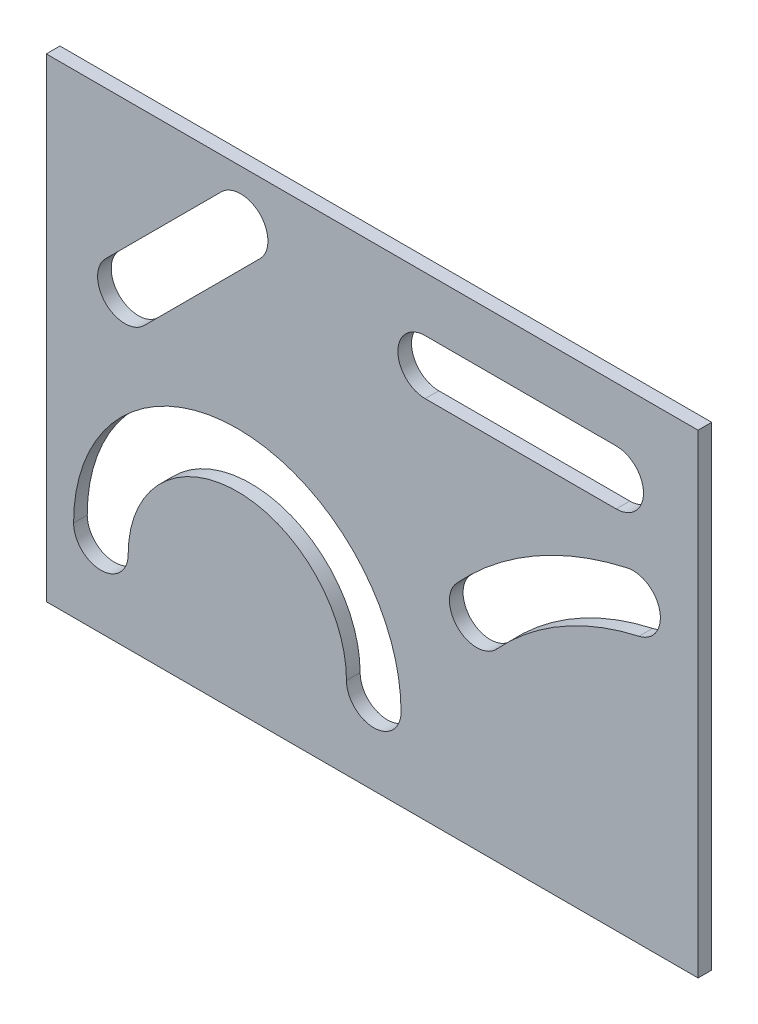
ISO-10303-21;
HEADER;
FILE_DESCRIPTION(('STEP AP214'),'2;1');
FILE_NAME('part.step','',(''),(''),'','','');
FILE_SCHEMA(('AUTOMOTIVE_DESIGN { 1 0 10303 214 1 1 1 1 }'));
ENDSEC;
DATA;
#1=APPLICATION_CONTEXT('core data for automotive mechanical design processes');
#2=APPLICATION_PROTOCOL_DEFINITION('international standard','automotive_design',2000,#1);
#3=PRODUCT_CONTEXT('',#1,'mechanical');
#4=PRODUCT('Part','Part','',(#3));
#5=PRODUCT_RELATED_PRODUCT_CATEGORY('part','',(#4));
#6=PRODUCT_DEFINITION_FORMATION('','',#4);
#7=PRODUCT_DEFINITION_CONTEXT('part definition',#1,'design');
#8=PRODUCT_DEFINITION('design','',#6,#7);
#9=PRODUCT_DEFINITION_SHAPE('','',#8);
#10=(LENGTH_UNIT() NAMED_UNIT(*) SI_UNIT(.MILLI.,.METRE.));
#11=(NAMED_UNIT(*) PLANE_ANGLE_UNIT() SI_UNIT($,.RADIAN.));
#12=(NAMED_UNIT(*) SI_UNIT($,.STERADIAN.) SOLID_ANGLE_UNIT());
#13=UNCERTAINTY_MEASURE_WITH_UNIT(LENGTH_MEASURE(1.E-05),#10,'distance_accuracy_value','');
#14=(GEOMETRIC_REPRESENTATION_CONTEXT(3) GLOBAL_UNCERTAINTY_ASSIGNED_CONTEXT((#13)) GLOBAL_UNIT_ASSIGNED_CONTEXT((#10,
#11,#12)) REPRESENTATION_CONTEXT('',''));
#15=CARTESIAN_POINT('',(0.,0.,0.));
#16=DIRECTION('',(0.,0.,1.));
#17=DIRECTION('',(1.,0.,0.));
#18=AXIS2_PLACEMENT_3D('',#15,#16,#17);
#19=CARTESIAN_POINT('',(238.835175967685,-173.857958976477,10.));
#20=DIRECTION('',(-1.,0.,0.));
#21=DIRECTION('',(0.,0.,1.));
#22=AXIS2_PLACEMENT_3D('',#19,#20,#21);
#23=PLANE('',#22);
#24=DIRECTION('',(0.,1.,0.));
#25=VECTOR('',#24,1.);
#26=CARTESIAN_POINT('',(238.835175967685,-173.857958976477,0.));
#27=LINE('',#26,#25);
#28=CARTESIAN_POINT('',(238.835175967685,-173.857958976477,0.));
#29=VERTEX_POINT('',#28);
#30=CARTESIAN_POINT('',(238.835175967685,173.857958976477,0.));
#31=VERTEX_POINT('',#30);
#32=EDGE_CURVE('E299',#29,#31,#27,.T.);
#33=ORIENTED_EDGE('',*,*,#32,.T.);
#34=DIRECTION('',(0.,0.,-1.));
#35=VECTOR('',#34,1.);
#36=CARTESIAN_POINT('',(238.835175967685,173.857958976477,10.));
#37=LINE('',#36,#35);
#38=CARTESIAN_POINT('',(238.835175967685,173.857958976477,10.));
#39=VERTEX_POINT('',#38);
#40=EDGE_CURVE('E11',#39,#31,#37,.T.);
#41=ORIENTED_EDGE('',*,*,#40,.F.);
#42=DIRECTION('',(0.,1.,0.));
#43=VECTOR('',#42,1.);
#44=CARTESIAN_POINT('',(238.835175967685,-173.857958976477,10.));
#45=LINE('',#44,#43);
#46=CARTESIAN_POINT('',(238.835175967685,-173.857958976477,10.));
#47=VERTEX_POINT('',#46);
#48=EDGE_CURVE('E306',#47,#39,#45,.T.);
#49=ORIENTED_EDGE('',*,*,#48,.F.);
#50=DIRECTION('',(0.,0.,-1.));
#51=VECTOR('',#50,1.);
#52=CARTESIAN_POINT('',(238.835175967685,-173.857958976477,10.));
#53=LINE('',#52,#51);
#54=EDGE_CURVE('E316',#47,#29,#53,.T.);
#55=ORIENTED_EDGE('',*,*,#54,.T.);
#56=EDGE_LOOP('',(#33,#41,#49,#55));
#57=FACE_BOUND('',#56,.T.);
#58=ADVANCED_FACE('F37',(#57),#23,.F.);
#59=CARTESIAN_POINT('',(-238.835175967685,173.857958976477,10.));
#60=DIRECTION('',(0.,-1.,0.));
#61=DIRECTION('',(0.,0.,-1.));
#62=AXIS2_PLACEMENT_3D('',#59,#60,#61);
#63=PLANE('',#62);
#64=DIRECTION('',(-1.,0.,0.));
#65=VECTOR('',#64,1.);
#66=CARTESIAN_POINT('',(-238.835175967685,173.857958976477,0.));
#67=LINE('',#66,#65);
#68=CARTESIAN_POINT('',(-238.835175967685,173.857958976477,0.));
#69=VERTEX_POINT('',#68);
#70=EDGE_CURVE('E319',#31,#69,#67,.T.);
#71=ORIENTED_EDGE('',*,*,#70,.T.);
#72=DIRECTION('',(0.,0.,-1.));
#73=VECTOR('',#72,1.);
#74=CARTESIAN_POINT('',(-238.835175967685,173.857958976477,10.));
#75=LINE('',#74,#73);
#76=CARTESIAN_POINT('',(-238.835175967685,173.857958976477,10.));
#77=VERTEX_POINT('',#76);
#78=EDGE_CURVE('E44',#77,#69,#75,.T.);
#79=ORIENTED_EDGE('',*,*,#78,.F.);
#80=DIRECTION('',(-1.,0.,0.));
#81=VECTOR('',#80,1.);
#82=CARTESIAN_POINT('',(-238.835175967685,173.857958976477,10.));
#83=LINE('',#82,#81);
#84=EDGE_CURVE('E309',#39,#77,#83,.T.);
#85=ORIENTED_EDGE('',*,*,#84,.F.);
#86=ORIENTED_EDGE('',*,*,#40,.T.);
#87=EDGE_LOOP('',(#71,#79,#85,#86));
#88=FACE_BOUND('',#87,.T.);
#89=ADVANCED_FACE('F348',(#88),#63,.F.);
#90=CARTESIAN_POINT('',(-238.835175967685,-173.857958976477,10.));
#91=DIRECTION('',(1.,0.,0.));
#92=DIRECTION('',(0.,0.,-1.));
#93=AXIS2_PLACEMENT_3D('',#90,#91,#92);
#94=PLANE('',#93);
#95=DIRECTION('',(0.,-1.,0.));
#96=VECTOR('',#95,1.);
#97=CARTESIAN_POINT('',(-238.835175967685,-173.857958976477,0.));
#98=LINE('',#97,#96);
#99=CARTESIAN_POINT('',(-238.835175967685,-173.857958976477,0.));
#100=VERTEX_POINT('',#99);
#101=EDGE_CURVE('E321',#69,#100,#98,.T.);
#102=ORIENTED_EDGE('',*,*,#101,.T.);
#103=DIRECTION('',(0.,0.,-1.));
#104=VECTOR('',#103,1.);
#105=CARTESIAN_POINT('',(-238.835175967685,-173.857958976477,10.));
#106=LINE('',#105,#104);
#107=CARTESIAN_POINT('',(-238.835175967685,-173.857958976477,10.));
#108=VERTEX_POINT('',#107);
#109=EDGE_CURVE('E326',#108,#100,#106,.T.);
#110=ORIENTED_EDGE('',*,*,#109,.F.);
#111=DIRECTION('',(0.,-1.,0.));
#112=VECTOR('',#111,1.);
#113=CARTESIAN_POINT('',(-238.835175967685,-173.857958976477,10.));
#114=LINE('',#113,#112);
#115=EDGE_CURVE('E312',#77,#108,#114,.T.);
#116=ORIENTED_EDGE('',*,*,#115,.F.);
#117=ORIENTED_EDGE('',*,*,#78,.T.);
#118=EDGE_LOOP('',(#102,#110,#116,#117));
#119=FACE_BOUND('',#118,.T.);
#120=ADVANCED_FACE('F333',(#119),#94,.F.);
#121=CARTESIAN_POINT('',(-238.835175967685,-173.857958976477,10.));
#122=DIRECTION('',(0.,1.,0.));
#123=DIRECTION('',(0.,0.,1.));
#124=AXIS2_PLACEMENT_3D('',#121,#122,#123);
#125=PLANE('',#124);
#126=DIRECTION('',(1.,0.,0.));
#127=VECTOR('',#126,1.);
#128=CARTESIAN_POINT('',(-238.835175967685,-173.857958976477,0.));
#129=LINE('',#128,#127);
#130=EDGE_CURVE('E310',#100,#29,#129,.T.);
#131=ORIENTED_EDGE('',*,*,#130,.T.);
#132=ORIENTED_EDGE('',*,*,#54,.F.);
#133=DIRECTION('',(1.,0.,0.));
#134=VECTOR('',#133,1.);
#135=CARTESIAN_POINT('',(-238.835175967685,-173.857958976477,10.));
#136=LINE('',#135,#134);
#137=EDGE_CURVE('E314',#108,#47,#136,.T.);
#138=ORIENTED_EDGE('',*,*,#137,.F.);
#139=ORIENTED_EDGE('',*,*,#109,.T.);
#140=EDGE_LOOP('',(#131,#132,#138,#139));
#141=FACE_BOUND('',#140,.T.);
#142=ADVANCED_FACE('F341',(#141),#125,.F.);
#143=CARTESIAN_POINT('',(0.,0.,10.));
#144=DIRECTION('',(0.,0.,-1.));
#145=DIRECTION('',(-1.,0.,0.));
#146=AXIS2_PLACEMENT_3D('',#143,#144,#145);
#147=PLANE('',#146);
#148=CARTESIAN_POINT('',(238.835175967685,-173.857958976477,10.));
#149=DIRECTION('',(0.,0.,1.));
#150=DIRECTION('',(1.,0.,0.));
#151=AXIS2_PLACEMENT_3D('',#148,#149,#150);
#152=CIRCLE('',#151,240.);
#153=CARTESIAN_POINT('',(186.88966862254,60.453082732307,10.));
#154=VERTEX_POINT('',#153);
#155=CARTESIAN_POINT('',(61.8886151332553,-11.7163091487189,10.));
#156=VERTEX_POINT('',#155);
#157=EDGE_CURVE('E200',#154,#156,#152,.T.);
#158=ORIENTED_EDGE('',*,*,#157,.F.);
#159=CARTESIAN_POINT('',(191.218460901303,40.9271625899084,10.));
#160=DIRECTION('',(0.,0.,1.));
#161=DIRECTION('',(1.,0.,0.));
#162=AXIS2_PLACEMENT_3D('',#159,#160,#161);
#163=CIRCLE('',#162,20.);
#164=CARTESIAN_POINT('',(195.547253180065,21.4012424475097,10.));
#165=VERTEX_POINT('',#164);
#166=EDGE_CURVE('E51',#165,#154,#163,.T.);
#167=ORIENTED_EDGE('',*,*,#166,.F.);
#168=CARTESIAN_POINT('',(238.835175967685,-173.857958976477,10.));
#169=DIRECTION('',(0.,0.,-1.));
#170=DIRECTION('',(1.,0.,0.));
#171=AXIS2_PLACEMENT_3D('',#168,#169,#170);
#172=CIRCLE('',#171,200.);
#173=CARTESIAN_POINT('',(91.3797086056603,-38.7399174533451,10.));
#174=VERTEX_POINT('',#173);
#175=EDGE_CURVE('E191',#174,#165,#172,.T.);
#176=ORIENTED_EDGE('',*,*,#175,.F.);
#177=CARTESIAN_POINT('',(76.6341618694577,-25.228113301032,10.));
#178=DIRECTION('',(0.,0.,1.));
#179=DIRECTION('',(1.,0.,0.));
#180=AXIS2_PLACEMENT_3D('',#177,#178,#179);
#181=CIRCLE('',#180,20.);
#182=EDGE_CURVE('E194',#156,#174,#181,.T.);
#183=ORIENTED_EDGE('',*,*,#182,.F.);
#184=EDGE_LOOP('',(#158,#167,#176,#183));
#185=FACE_BOUND('',#184,.T.);
#186=CARTESIAN_POINT('',(-98.8351759676853,-113.857958976477,10.));
#187=DIRECTION('',(0.,0.,1.));
#188=DIRECTION('',(1.,0.,0.));
#189=AXIS2_PLACEMENT_3D('',#186,#187,#188);
#190=CIRCLE('',#189,120.);
#191=CARTESIAN_POINT('',(21.1648240323147,-113.857958976477,10.));
#192=VERTEX_POINT('',#191);
#193=CARTESIAN_POINT('',(-218.835175967685,-113.857958976477,10.));
#194=VERTEX_POINT('',#193);
#195=EDGE_CURVE('E225',#192,#194,#190,.T.);
#196=ORIENTED_EDGE('',*,*,#195,.F.);
#197=CARTESIAN_POINT('',(1.1648240323147,-113.857958976477,10.));
#198=DIRECTION('',(0.,0.,1.));
#199=DIRECTION('',(1.,0.,0.));
#200=AXIS2_PLACEMENT_3D('',#197,#198,#199);
#201=CIRCLE('',#200,20.);
#202=CARTESIAN_POINT('',(-18.8351759676853,-113.857958976477,10.));
#203=VERTEX_POINT('',#202);
#204=EDGE_CURVE('E206',#203,#192,#201,.T.);
#205=ORIENTED_EDGE('',*,*,#204,.F.);
#206=CARTESIAN_POINT('',(-98.8351759676853,-113.857958976477,10.));
#207=DIRECTION('',(0.,0.,-1.));
#208=DIRECTION('',(1.,0.,0.));
#209=AXIS2_PLACEMENT_3D('',#206,#207,#208);
#210=CIRCLE('',#209,80.);
#211=CARTESIAN_POINT('',(-178.835175967685,-113.857958976477,10.));
#212=VERTEX_POINT('',#211);
#213=EDGE_CURVE('E214',#212,#203,#210,.T.);
#214=ORIENTED_EDGE('',*,*,#213,.F.);
#215=CARTESIAN_POINT('',(-198.835175967685,-113.857958976477,10.));
#216=DIRECTION('',(0.,0.,1.));
#217=DIRECTION('',(1.,0.,0.));
#218=AXIS2_PLACEMENT_3D('',#215,#216,#217);
#219=CIRCLE('',#218,20.);
#220=EDGE_CURVE('E228',#194,#212,#219,.T.);
#221=ORIENTED_EDGE('',*,*,#220,.F.);
#222=EDGE_LOOP('',(#196,#205,#214,#221));
#223=FACE_BOUND('',#222,.T.);
#224=DIRECTION('',(1.,0.,0.));
#225=VECTOR('',#224,1.);
#226=CARTESIAN_POINT('',(38.8351759676853,93.8579589764769,10.));
#227=LINE('',#226,#225);
#228=CARTESIAN_POINT('',(38.8351759676853,93.8579589764769,10.));
#229=VERTEX_POINT('',#228);
#230=CARTESIAN_POINT('',(178.835175967685,93.857958976477,10.));
#231=VERTEX_POINT('',#230);
#232=EDGE_CURVE('E257',#229,#231,#227,.T.);
#233=ORIENTED_EDGE('',*,*,#232,.F.);
#234=CARTESIAN_POINT('',(38.8351759676853,113.857958976477,10.));
#235=DIRECTION('',(0.,0.,1.));
#236=DIRECTION('',(1.,0.,0.));
#237=AXIS2_PLACEMENT_3D('',#234,#235,#236);
#238=CIRCLE('',#237,20.);
#239=CARTESIAN_POINT('',(38.8351759676853,133.857958976477,10.));
#240=VERTEX_POINT('',#239);
#241=EDGE_CURVE('E235',#240,#229,#238,.T.);
#242=ORIENTED_EDGE('',*,*,#241,.F.);
#243=DIRECTION('',(-1.,0.,0.));
#244=VECTOR('',#243,1.);
#245=CARTESIAN_POINT('',(38.8351759676853,133.857958976477,10.));
#246=LINE('',#245,#244);
#247=CARTESIAN_POINT('',(178.835175967685,133.857958976477,10.));
#248=VERTEX_POINT('',#247);
#249=EDGE_CURVE('E246',#248,#240,#246,.T.);
#250=ORIENTED_EDGE('',*,*,#249,.F.);
#251=CARTESIAN_POINT('',(178.835175967685,113.857958976477,10.));
#252=DIRECTION('',(0.,0.,1.));
#253=DIRECTION('',(1.,0.,0.));
#254=AXIS2_PLACEMENT_3D('',#251,#252,#253);
#255=CIRCLE('',#254,20.);
#256=EDGE_CURVE('E260',#231,#248,#255,.T.);
#257=ORIENTED_EDGE('',*,*,#256,.F.);
#258=EDGE_LOOP('',(#233,#242,#250,#257));
#259=FACE_BOUND('',#258,.T.);
#260=DIRECTION('',(0.707106781186552,0.707106781186543,0.));
#261=VECTOR('',#260,1.);
#262=CARTESIAN_POINT('',(-167.119447215148,37.2894164815533,10.));
#263=LINE('',#262,#261);
#264=CARTESIAN_POINT('',(-167.119447215148,37.2894164815533,10.));
#265=VERTEX_POINT('',#264);
#266=CARTESIAN_POINT('',(-82.2666334727614,122.142230223938,10.));
#267=VERTEX_POINT('',#266);
#268=EDGE_CURVE('E289',#265,#267,#263,.T.);
#269=ORIENTED_EDGE('',*,*,#268,.F.);
#270=CARTESIAN_POINT('',(-181.261582838878,51.4315521052843,10.));
#271=DIRECTION('',(0.,0.,1.));
#272=DIRECTION('',(1.,0.,0.));
#273=AXIS2_PLACEMENT_3D('',#270,#271,#272);
#274=CIRCLE('',#273,20.);
#275=CARTESIAN_POINT('',(-195.403718462609,65.5736877290153,10.));
#276=VERTEX_POINT('',#275);
#277=EDGE_CURVE('E267',#276,#265,#274,.T.);
#278=ORIENTED_EDGE('',*,*,#277,.F.);
#279=DIRECTION('',(-0.707106781186551,-0.707106781186544,0.));
#280=VECTOR('',#279,1.);
#281=CARTESIAN_POINT('',(-195.403718462609,65.5736877290153,10.));
#282=LINE('',#281,#280);
#283=CARTESIAN_POINT('',(-110.550904720223,150.426501471401,10.));
#284=VERTEX_POINT('',#283);
#285=EDGE_CURVE('E278',#284,#276,#282,.T.);
#286=ORIENTED_EDGE('',*,*,#285,.F.);
#287=CARTESIAN_POINT('',(-96.4087690964922,136.28436584767,10.));
#288=DIRECTION('',(0.,0.,1.));
#289=DIRECTION('',(1.,0.,0.));
#290=AXIS2_PLACEMENT_3D('',#287,#288,#289);
#291=CIRCLE('',#290,20.);
#292=EDGE_CURVE('E292',#267,#284,#291,.T.);
#293=ORIENTED_EDGE('',*,*,#292,.F.);
#294=EDGE_LOOP('',(#269,#278,#286,#293));
#295=FACE_BOUND('',#294,.T.);
#296=ORIENTED_EDGE('',*,*,#48,.T.);
#297=ORIENTED_EDGE('',*,*,#84,.T.);
#298=ORIENTED_EDGE('',*,*,#115,.T.);
#299=ORIENTED_EDGE('',*,*,#137,.T.);
#300=EDGE_LOOP('',(#296,#297,#298,#299));
#301=FACE_BOUND('',#300,.T.);
#302=ADVANCED_FACE('F347',(#185,#223,#259,#295,#301),#147,.F.);
#303=CARTESIAN_POINT('',(0.,0.,0.));
#304=DIRECTION('',(0.,0.,-1.));
#305=DIRECTION('',(-1.,0.,0.));
#306=AXIS2_PLACEMENT_3D('',#303,#304,#305);
#307=PLANE('',#306);
#308=CARTESIAN_POINT('',(191.218460901303,40.9271625899084,0.));
#309=DIRECTION('',(0.,0.,1.));
#310=DIRECTION('',(1.,0.,0.));
#311=AXIS2_PLACEMENT_3D('',#308,#309,#310);
#312=CIRCLE('',#311,20.);
#313=CARTESIAN_POINT('',(195.547253180065,21.4012424475097,0.));
#314=VERTEX_POINT('',#313);
#315=CARTESIAN_POINT('',(186.88966862254,60.453082732307,0.));
#316=VERTEX_POINT('',#315);
#317=EDGE_CURVE('E175',#314,#316,#312,.T.);
#318=ORIENTED_EDGE('',*,*,#317,.T.);
#319=CARTESIAN_POINT('',(238.835175967685,-173.857958976477,0.));
#320=DIRECTION('',(0.,0.,1.));
#321=DIRECTION('',(1.,0.,0.));
#322=AXIS2_PLACEMENT_3D('',#319,#320,#321);
#323=CIRCLE('',#322,240.);
#324=CARTESIAN_POINT('',(61.8886151332553,-11.7163091487189,0.));
#325=VERTEX_POINT('',#324);
#326=EDGE_CURVE('E184',#316,#325,#323,.T.);
#327=ORIENTED_EDGE('',*,*,#326,.T.);
#328=CARTESIAN_POINT('',(76.6341618694577,-25.228113301032,0.));
#329=DIRECTION('',(0.,0.,1.));
#330=DIRECTION('',(1.,0.,0.));
#331=AXIS2_PLACEMENT_3D('',#328,#329,#330);
#332=CIRCLE('',#331,20.);
#333=CARTESIAN_POINT('',(91.3797086056603,-38.7399174533451,0.));
#334=VERTEX_POINT('',#333);
#335=EDGE_CURVE('E59',#325,#334,#332,.T.);
#336=ORIENTED_EDGE('',*,*,#335,.T.);
#337=CARTESIAN_POINT('',(238.835175967685,-173.857958976477,0.));
#338=DIRECTION('',(0.,0.,-1.));
#339=DIRECTION('',(1.,0.,0.));
#340=AXIS2_PLACEMENT_3D('',#337,#338,#339);
#341=CIRCLE('',#340,200.);
#342=EDGE_CURVE('E181',#334,#314,#341,.T.);
#343=ORIENTED_EDGE('',*,*,#342,.T.);
#344=EDGE_LOOP('',(#318,#327,#336,#343));
#345=FACE_BOUND('',#344,.T.);
#346=CARTESIAN_POINT('',(1.1648240323147,-113.857958976477,0.));
#347=DIRECTION('',(0.,0.,1.));
#348=DIRECTION('',(1.,0.,0.));
#349=AXIS2_PLACEMENT_3D('',#346,#347,#348);
#350=CIRCLE('',#349,20.);
#351=CARTESIAN_POINT('',(-18.8351759676853,-113.857958976477,0.));
#352=VERTEX_POINT('',#351);
#353=CARTESIAN_POINT('',(21.1648240323147,-113.857958976477,0.));
#354=VERTEX_POINT('',#353);
#355=EDGE_CURVE('E210',#352,#354,#350,.T.);
#356=ORIENTED_EDGE('',*,*,#355,.T.);
#357=CARTESIAN_POINT('',(-98.8351759676853,-113.857958976477,0.));
#358=DIRECTION('',(0.,0.,1.));
#359=DIRECTION('',(1.,0.,0.));
#360=AXIS2_PLACEMENT_3D('',#357,#358,#359);
#361=CIRCLE('',#360,120.);
#362=CARTESIAN_POINT('',(-218.835175967685,-113.857958976477,0.));
#363=VERTEX_POINT('',#362);
#364=EDGE_CURVE('E213',#354,#363,#361,.T.);
#365=ORIENTED_EDGE('',*,*,#364,.T.);
#366=CARTESIAN_POINT('',(-198.835175967685,-113.857958976477,0.));
#367=DIRECTION('',(0.,0.,1.));
#368=DIRECTION('',(1.,0.,0.));
#369=AXIS2_PLACEMENT_3D('',#366,#367,#368);
#370=CIRCLE('',#369,20.);
#371=CARTESIAN_POINT('',(-178.835175967685,-113.857958976477,0.));
#372=VERTEX_POINT('',#371);
#373=EDGE_CURVE('E217',#363,#372,#370,.T.);
#374=ORIENTED_EDGE('',*,*,#373,.T.);
#375=CARTESIAN_POINT('',(-98.8351759676853,-113.857958976477,0.));
#376=DIRECTION('',(0.,0.,-1.));
#377=DIRECTION('',(1.,0.,0.));
#378=AXIS2_PLACEMENT_3D('',#375,#376,#377);
#379=CIRCLE('',#378,80.);
#380=EDGE_CURVE('E220',#372,#352,#379,.T.);
#381=ORIENTED_EDGE('',*,*,#380,.T.);
#382=EDGE_LOOP('',(#356,#365,#374,#381));
#383=FACE_BOUND('',#382,.T.);
#384=CARTESIAN_POINT('',(38.8351759676853,113.857958976477,0.));
#385=DIRECTION('',(0.,0.,1.));
#386=DIRECTION('',(1.,0.,0.));
#387=AXIS2_PLACEMENT_3D('',#384,#385,#386);
#388=CIRCLE('',#387,20.);
#389=CARTESIAN_POINT('',(38.8351759676853,133.857958976477,0.));
#390=VERTEX_POINT('',#389);
#391=CARTESIAN_POINT('',(38.8351759676853,93.8579589764769,0.));
#392=VERTEX_POINT('',#391);
#393=EDGE_CURVE('E242',#390,#392,#388,.T.);
#394=ORIENTED_EDGE('',*,*,#393,.T.);
#395=DIRECTION('',(1.,0.,0.));
#396=VECTOR('',#395,1.);
#397=CARTESIAN_POINT('',(38.8351759676853,93.8579589764769,0.));
#398=LINE('',#397,#396);
#399=CARTESIAN_POINT('',(178.835175967685,93.857958976477,0.));
#400=VERTEX_POINT('',#399);
#401=EDGE_CURVE('E245',#392,#400,#398,.T.);
#402=ORIENTED_EDGE('',*,*,#401,.T.);
#403=CARTESIAN_POINT('',(178.835175967685,113.857958976477,0.));
#404=DIRECTION('',(0.,0.,1.));
#405=DIRECTION('',(1.,0.,0.));
#406=AXIS2_PLACEMENT_3D('',#403,#404,#405);
#407=CIRCLE('',#406,20.);
#408=CARTESIAN_POINT('',(178.835175967685,133.857958976477,0.));
#409=VERTEX_POINT('',#408);
#410=EDGE_CURVE('E249',#400,#409,#407,.T.);
#411=ORIENTED_EDGE('',*,*,#410,.T.);
#412=DIRECTION('',(-1.,0.,0.));
#413=VECTOR('',#412,1.);
#414=CARTESIAN_POINT('',(38.8351759676853,133.857958976477,0.));
#415=LINE('',#414,#413);
#416=EDGE_CURVE('E252',#409,#390,#415,.T.);
#417=ORIENTED_EDGE('',*,*,#416,.T.);
#418=EDGE_LOOP('',(#394,#402,#411,#417));
#419=FACE_BOUND('',#418,.T.);
#420=CARTESIAN_POINT('',(-181.261582838878,51.4315521052843,0.));
#421=DIRECTION('',(0.,0.,1.));
#422=DIRECTION('',(1.,0.,0.));
#423=AXIS2_PLACEMENT_3D('',#420,#421,#422);
#424=CIRCLE('',#423,20.);
#425=CARTESIAN_POINT('',(-195.403718462609,65.5736877290153,0.));
#426=VERTEX_POINT('',#425);
#427=CARTESIAN_POINT('',(-167.119447215148,37.2894164815533,0.));
#428=VERTEX_POINT('',#427);
#429=EDGE_CURVE('E274',#426,#428,#424,.T.);
#430=ORIENTED_EDGE('',*,*,#429,.T.);
#431=DIRECTION('',(0.707106781186552,0.707106781186543,0.));
#432=VECTOR('',#431,1.);
#433=CARTESIAN_POINT('',(-167.119447215148,37.2894164815533,0.));
#434=LINE('',#433,#432);
#435=CARTESIAN_POINT('',(-82.2666334727614,122.142230223938,0.));
#436=VERTEX_POINT('',#435);
#437=EDGE_CURVE('E277',#428,#436,#434,.T.);
#438=ORIENTED_EDGE('',*,*,#437,.T.);
#439=CARTESIAN_POINT('',(-96.4087690964922,136.28436584767,0.));
#440=DIRECTION('',(0.,0.,1.));
#441=DIRECTION('',(1.,0.,0.));
#442=AXIS2_PLACEMENT_3D('',#439,#440,#441);
#443=CIRCLE('',#442,20.);
#444=CARTESIAN_POINT('',(-110.550904720223,150.426501471401,0.));
#445=VERTEX_POINT('',#444);
#446=EDGE_CURVE('E281',#436,#445,#443,.T.);
#447=ORIENTED_EDGE('',*,*,#446,.T.);
#448=DIRECTION('',(-0.707106781186551,-0.707106781186544,0.));
#449=VECTOR('',#448,1.);
#450=CARTESIAN_POINT('',(-195.403718462609,65.5736877290153,0.));
#451=LINE('',#450,#449);
#452=EDGE_CURVE('E284',#445,#426,#451,.T.);
#453=ORIENTED_EDGE('',*,*,#452,.T.);
#454=EDGE_LOOP('',(#430,#438,#447,#453));
#455=FACE_BOUND('',#454,.T.);
#456=ORIENTED_EDGE('',*,*,#32,.F.);
#457=ORIENTED_EDGE('',*,*,#130,.F.);
#458=ORIENTED_EDGE('',*,*,#101,.F.);
#459=ORIENTED_EDGE('',*,*,#70,.F.);
#460=EDGE_LOOP('',(#456,#457,#458,#459));
#461=FACE_BOUND('',#460,.T.);
#462=ADVANCED_FACE('F188',(#345,#383,#419,#455,#461),#307,.T.);
#463=CARTESIAN_POINT('',(-181.261582838878,51.4315521052843,0.));
#464=DIRECTION('',(0.,0.,1.));
#465=DIRECTION('',(1.,0.,0.));
#466=AXIS2_PLACEMENT_3D('',#463,#464,#465);
#467=CYLINDRICAL_SURFACE('',#466,20.);
#468=ORIENTED_EDGE('',*,*,#277,.T.);
#469=DIRECTION('',(0.,0.,1.));
#470=VECTOR('',#469,1.);
#471=CARTESIAN_POINT('',(-167.119447215148,37.2894164815533,0.));
#472=LINE('',#471,#470);
#473=EDGE_CURVE('E287',#428,#265,#472,.T.);
#474=ORIENTED_EDGE('',*,*,#473,.F.);
#475=ORIENTED_EDGE('',*,*,#429,.F.);
#476=DIRECTION('',(0.,0.,1.));
#477=VECTOR('',#476,1.);
#478=CARTESIAN_POINT('',(-195.403718462609,65.5736877290153,0.));
#479=LINE('',#478,#477);
#480=EDGE_CURVE('E297',#426,#276,#479,.T.);
#481=ORIENTED_EDGE('',*,*,#480,.T.);
#482=EDGE_LOOP('',(#468,#474,#475,#481));
#483=FACE_BOUND('',#482,.T.);
#484=ADVANCED_FACE('F360',(#483),#467,.F.);
#485=CARTESIAN_POINT('',(-195.403718462609,65.5736877290153,0.));
#486=DIRECTION('',(-0.707106781186544,0.707106781186551,0.));
#487=DIRECTION('',(-0.707106781186551,-0.707106781186544,0.));
#488=AXIS2_PLACEMENT_3D('',#485,#486,#487);
#489=PLANE('',#488);
#490=ORIENTED_EDGE('',*,*,#285,.T.);
#491=ORIENTED_EDGE('',*,*,#480,.F.);
#492=ORIENTED_EDGE('',*,*,#452,.F.);
#493=DIRECTION('',(0.,0.,1.));
#494=VECTOR('',#493,1.);
#495=CARTESIAN_POINT('',(-110.550904720223,150.426501471401,0.));
#496=LINE('',#495,#494);
#497=EDGE_CURVE('E300',#445,#284,#496,.T.);
#498=ORIENTED_EDGE('',*,*,#497,.T.);
#499=EDGE_LOOP('',(#490,#491,#492,#498));
#500=FACE_BOUND('',#499,.T.);
#501=ADVANCED_FACE('F366',(#500),#489,.F.);
#502=CARTESIAN_POINT('',(-96.4087690964922,136.28436584767,0.));
#503=DIRECTION('',(0.,0.,1.));
#504=DIRECTION('',(1.,0.,0.));
#505=AXIS2_PLACEMENT_3D('',#502,#503,#504);
#506=CYLINDRICAL_SURFACE('',#505,20.);
#507=ORIENTED_EDGE('',*,*,#292,.T.);
#508=ORIENTED_EDGE('',*,*,#497,.F.);
#509=ORIENTED_EDGE('',*,*,#446,.F.);
#510=DIRECTION('',(0.,0.,1.));
#511=VECTOR('',#510,1.);
#512=CARTESIAN_POINT('',(-82.2666334727614,122.142230223938,0.));
#513=LINE('',#512,#511);
#514=EDGE_CURVE('E302',#436,#267,#513,.T.);
#515=ORIENTED_EDGE('',*,*,#514,.T.);
#516=EDGE_LOOP('',(#507,#508,#509,#515));
#517=FACE_BOUND('',#516,.T.);
#518=ADVANCED_FACE('F372',(#517),#506,.F.);
#519=CARTESIAN_POINT('',(-167.119447215148,37.2894164815533,0.));
#520=DIRECTION('',(0.707106781186543,-0.707106781186552,0.));
#521=DIRECTION('',(0.707106781186552,0.707106781186543,0.));
#522=AXIS2_PLACEMENT_3D('',#519,#520,#521);
#523=PLANE('',#522);
#524=ORIENTED_EDGE('',*,*,#268,.T.);
#525=ORIENTED_EDGE('',*,*,#514,.F.);
#526=ORIENTED_EDGE('',*,*,#437,.F.);
#527=ORIENTED_EDGE('',*,*,#473,.T.);
#528=EDGE_LOOP('',(#524,#525,#526,#527));
#529=FACE_BOUND('',#528,.T.);
#530=ADVANCED_FACE('F368',(#529),#523,.F.);
#531=CARTESIAN_POINT('',(38.8351759676853,113.857958976477,0.));
#532=DIRECTION('',(0.,0.,1.));
#533=DIRECTION('',(1.,0.,0.));
#534=AXIS2_PLACEMENT_3D('',#531,#532,#533);
#535=CYLINDRICAL_SURFACE('',#534,20.);
#536=ORIENTED_EDGE('',*,*,#241,.T.);
#537=DIRECTION('',(0.,0.,1.));
#538=VECTOR('',#537,1.);
#539=CARTESIAN_POINT('',(38.8351759676853,93.8579589764769,0.));
#540=LINE('',#539,#538);
#541=EDGE_CURVE('E255',#392,#229,#540,.T.);
#542=ORIENTED_EDGE('',*,*,#541,.F.);
#543=ORIENTED_EDGE('',*,*,#393,.F.);
#544=DIRECTION('',(0.,0.,1.));
#545=VECTOR('',#544,1.);
#546=CARTESIAN_POINT('',(38.8351759676853,133.857958976477,0.));
#547=LINE('',#546,#545);
#548=EDGE_CURVE('E265',#390,#240,#547,.T.);
#549=ORIENTED_EDGE('',*,*,#548,.T.);
#550=EDGE_LOOP('',(#536,#542,#543,#549));
#551=FACE_BOUND('',#550,.T.);
#552=ADVANCED_FACE('F371',(#551),#535,.F.);
#553=CARTESIAN_POINT('',(38.8351759676853,133.857958976477,0.));
#554=DIRECTION('',(0.,1.,0.));
#555=DIRECTION('',(-1.,0.,0.));
#556=AXIS2_PLACEMENT_3D('',#553,#554,#555);
#557=PLANE('',#556);
#558=ORIENTED_EDGE('',*,*,#249,.T.);
#559=ORIENTED_EDGE('',*,*,#548,.F.);
#560=ORIENTED_EDGE('',*,*,#416,.F.);
#561=DIRECTION('',(0.,0.,1.));
#562=VECTOR('',#561,1.);
#563=CARTESIAN_POINT('',(178.835175967685,133.857958976477,0.));
#564=LINE('',#563,#562);
#565=EDGE_CURVE('E268',#409,#248,#564,.T.);
#566=ORIENTED_EDGE('',*,*,#565,.T.);
#567=EDGE_LOOP('',(#558,#559,#560,#566));
#568=FACE_BOUND('',#567,.T.);
#569=ADVANCED_FACE('F382',(#568),#557,.F.);
#570=CARTESIAN_POINT('',(178.835175967685,113.857958976477,0.));
#571=DIRECTION('',(0.,0.,1.));
#572=DIRECTION('',(1.,0.,0.));
#573=AXIS2_PLACEMENT_3D('',#570,#571,#572);
#574=CYLINDRICAL_SURFACE('',#573,20.);
#575=ORIENTED_EDGE('',*,*,#256,.T.);
#576=ORIENTED_EDGE('',*,*,#565,.F.);
#577=ORIENTED_EDGE('',*,*,#410,.F.);
#578=DIRECTION('',(0.,0.,1.));
#579=VECTOR('',#578,1.);
#580=CARTESIAN_POINT('',(178.835175967685,93.857958976477,0.));
#581=LINE('',#580,#579);
#582=EDGE_CURVE('E270',#400,#231,#581,.T.);
#583=ORIENTED_EDGE('',*,*,#582,.T.);
#584=EDGE_LOOP('',(#575,#576,#577,#583));
#585=FACE_BOUND('',#584,.T.);
#586=ADVANCED_FACE('F388',(#585),#574,.F.);
#587=CARTESIAN_POINT('',(38.8351759676853,93.8579589764769,0.));
#588=DIRECTION('',(0.,-1.,0.));
#589=DIRECTION('',(1.,0.,0.));
#590=AXIS2_PLACEMENT_3D('',#587,#588,#589);
#591=PLANE('',#590);
#592=ORIENTED_EDGE('',*,*,#232,.T.);
#593=ORIENTED_EDGE('',*,*,#582,.F.);
#594=ORIENTED_EDGE('',*,*,#401,.F.);
#595=ORIENTED_EDGE('',*,*,#541,.T.);
#596=EDGE_LOOP('',(#592,#593,#594,#595));
#597=FACE_BOUND('',#596,.T.);
#598=ADVANCED_FACE('F384',(#597),#591,.F.);
#599=CARTESIAN_POINT('',(1.1648240323147,-113.857958976477,0.));
#600=DIRECTION('',(0.,0.,1.));
#601=DIRECTION('',(1.,0.,0.));
#602=AXIS2_PLACEMENT_3D('',#599,#600,#601);
#603=CYLINDRICAL_SURFACE('',#602,20.);
#604=ORIENTED_EDGE('',*,*,#204,.T.);
#605=DIRECTION('',(0.,0.,1.));
#606=VECTOR('',#605,1.);
#607=CARTESIAN_POINT('',(21.1648240323147,-113.857958976477,0.));
#608=LINE('',#607,#606);
#609=EDGE_CURVE('E223',#354,#192,#608,.T.);
#610=ORIENTED_EDGE('',*,*,#609,.F.);
#611=ORIENTED_EDGE('',*,*,#355,.F.);
#612=DIRECTION('',(0.,0.,1.));
#613=VECTOR('',#612,1.);
#614=CARTESIAN_POINT('',(-18.8351759676853,-113.857958976477,0.));
#615=LINE('',#614,#613);
#616=EDGE_CURVE('E233',#352,#203,#615,.T.);
#617=ORIENTED_EDGE('',*,*,#616,.T.);
#618=EDGE_LOOP('',(#604,#610,#611,#617));
#619=FACE_BOUND('',#618,.T.);
#620=ADVANCED_FACE('F387',(#619),#603,.F.);
#621=CARTESIAN_POINT('',(-98.8351759676853,-113.857958976477,0.));
#622=DIRECTION('',(0.,0.,1.));
#623=DIRECTION('',(1.,0.,0.));
#624=AXIS2_PLACEMENT_3D('',#621,#622,#623);
#625=CYLINDRICAL_SURFACE('',#624,80.);
#626=ORIENTED_EDGE('',*,*,#213,.T.);
#627=ORIENTED_EDGE('',*,*,#616,.F.);
#628=ORIENTED_EDGE('',*,*,#380,.F.);
#629=DIRECTION('',(0.,0.,1.));
#630=VECTOR('',#629,1.);
#631=CARTESIAN_POINT('',(-178.835175967685,-113.857958976477,0.));
#632=LINE('',#631,#630);
#633=EDGE_CURVE('E236',#372,#212,#632,.T.);
#634=ORIENTED_EDGE('',*,*,#633,.T.);
#635=EDGE_LOOP('',(#626,#627,#628,#634));
#636=FACE_BOUND('',#635,.T.);
#637=ADVANCED_FACE('F398',(#636),#625,.T.);
#638=CARTESIAN_POINT('',(-198.835175967685,-113.857958976477,0.));
#639=DIRECTION('',(0.,0.,1.));
#640=DIRECTION('',(1.,0.,0.));
#641=AXIS2_PLACEMENT_3D('',#638,#639,#640);
#642=CYLINDRICAL_SURFACE('',#641,20.);
#643=ORIENTED_EDGE('',*,*,#220,.T.);
#644=ORIENTED_EDGE('',*,*,#633,.F.);
#645=ORIENTED_EDGE('',*,*,#373,.F.);
#646=DIRECTION('',(0.,0.,1.));
#647=VECTOR('',#646,1.);
#648=CARTESIAN_POINT('',(-218.835175967685,-113.857958976477,0.));
#649=LINE('',#648,#647);
#650=EDGE_CURVE('E238',#363,#194,#649,.T.);
#651=ORIENTED_EDGE('',*,*,#650,.T.);
#652=EDGE_LOOP('',(#643,#644,#645,#651));
#653=FACE_BOUND('',#652,.T.);
#654=ADVANCED_FACE('F403',(#653),#642,.F.);
#655=CARTESIAN_POINT('',(-98.8351759676853,-113.857958976477,0.));
#656=DIRECTION('',(0.,0.,1.));
#657=DIRECTION('',(1.,0.,0.));
#658=AXIS2_PLACEMENT_3D('',#655,#656,#657);
#659=CYLINDRICAL_SURFACE('',#658,120.);
#660=ORIENTED_EDGE('',*,*,#195,.T.);
#661=ORIENTED_EDGE('',*,*,#650,.F.);
#662=ORIENTED_EDGE('',*,*,#364,.F.);
#663=ORIENTED_EDGE('',*,*,#609,.T.);
#664=EDGE_LOOP('',(#660,#661,#662,#663));
#665=FACE_BOUND('',#664,.T.);
#666=ADVANCED_FACE('F400',(#665),#659,.F.);
#667=CARTESIAN_POINT('',(191.218460901303,40.9271625899084,0.));
#668=DIRECTION('',(0.,0.,1.));
#669=DIRECTION('',(1.,0.,0.));
#670=AXIS2_PLACEMENT_3D('',#667,#668,#669);
#671=CYLINDRICAL_SURFACE('',#670,20.);
#672=ORIENTED_EDGE('',*,*,#166,.T.);
#673=DIRECTION('',(0.,0.,1.));
#674=VECTOR('',#673,1.);
#675=CARTESIAN_POINT('',(186.88966862254,60.453082732307,0.));
#676=LINE('',#675,#674);
#677=EDGE_CURVE('E171',#316,#154,#676,.T.);
#678=ORIENTED_EDGE('',*,*,#677,.F.);
#679=ORIENTED_EDGE('',*,*,#317,.F.);
#680=DIRECTION('',(0.,0.,1.));
#681=VECTOR('',#680,1.);
#682=CARTESIAN_POINT('',(195.547253180065,21.4012424475097,0.));
#683=LINE('',#682,#681);
#684=EDGE_CURVE('E204',#314,#165,#683,.T.);
#685=ORIENTED_EDGE('',*,*,#684,.T.);
#686=EDGE_LOOP('',(#672,#678,#679,#685));
#687=FACE_BOUND('',#686,.T.);
#688=ADVANCED_FACE('F173',(#687),#671,.F.);
#689=CARTESIAN_POINT('',(238.835175967685,-173.857958976477,0.));
#690=DIRECTION('',(0.,0.,1.));
#691=DIRECTION('',(1.,0.,0.));
#692=AXIS2_PLACEMENT_3D('',#689,#690,#691);
#693=CYLINDRICAL_SURFACE('',#692,200.);
#694=ORIENTED_EDGE('',*,*,#175,.T.);
#695=ORIENTED_EDGE('',*,*,#684,.F.);
#696=ORIENTED_EDGE('',*,*,#342,.F.);
#697=DIRECTION('',(0.,0.,1.));
#698=VECTOR('',#697,1.);
#699=CARTESIAN_POINT('',(91.3797086056603,-38.7399174533451,0.));
#700=LINE('',#699,#698);
#701=EDGE_CURVE('E207',#334,#174,#700,.T.);
#702=ORIENTED_EDGE('',*,*,#701,.T.);
#703=EDGE_LOOP('',(#694,#695,#696,#702));
#704=FACE_BOUND('',#703,.T.);
#705=ADVANCED_FACE('F413',(#704),#693,.T.);
#706=CARTESIAN_POINT('',(76.6341618694577,-25.228113301032,0.));
#707=DIRECTION('',(0.,0.,1.));
#708=DIRECTION('',(1.,0.,0.));
#709=AXIS2_PLACEMENT_3D('',#706,#707,#708);
#710=CYLINDRICAL_SURFACE('',#709,20.);
#711=ORIENTED_EDGE('',*,*,#182,.T.);
#712=ORIENTED_EDGE('',*,*,#701,.F.);
#713=ORIENTED_EDGE('',*,*,#335,.F.);
#714=DIRECTION('',(0.,0.,1.));
#715=VECTOR('',#714,1.);
#716=CARTESIAN_POINT('',(61.8886151332553,-11.7163091487189,0.));
#717=LINE('',#716,#715);
#718=EDGE_CURVE('E180',#325,#156,#717,.T.);
#719=ORIENTED_EDGE('',*,*,#718,.T.);
#720=EDGE_LOOP('',(#711,#712,#713,#719));
#721=FACE_BOUND('',#720,.T.);
#722=ADVANCED_FACE('F416',(#721),#710,.F.);
#723=CARTESIAN_POINT('',(238.835175967685,-173.857958976477,0.));
#724=DIRECTION('',(0.,0.,1.));
#725=DIRECTION('',(1.,0.,0.));
#726=AXIS2_PLACEMENT_3D('',#723,#724,#725);
#727=CYLINDRICAL_SURFACE('',#726,240.);
#728=ORIENTED_EDGE('',*,*,#157,.T.);
#729=ORIENTED_EDGE('',*,*,#718,.F.);
#730=ORIENTED_EDGE('',*,*,#326,.F.);
#731=ORIENTED_EDGE('',*,*,#677,.T.);
#732=EDGE_LOOP('',(#728,#729,#730,#731));
#733=FACE_BOUND('',#732,.T.);
#734=ADVANCED_FACE('F185',(#733),#727,.F.);
#735=CLOSED_SHELL('',(#58,#89,#120,#142,#302,#462,#484,#501,#518,#530,#552,#569,#586,#598,#620,
#637,#654,#666,#688,#705,#722,#734));
#736=MANIFOLD_SOLID_BREP('B2',#735);
#737=ADVANCED_BREP_SHAPE_REPRESENTATION('',(#18,#736),#14);
#738=SHAPE_DEFINITION_REPRESENTATION(#9,#737);
ENDSEC;
END-ISO-10303-21;
